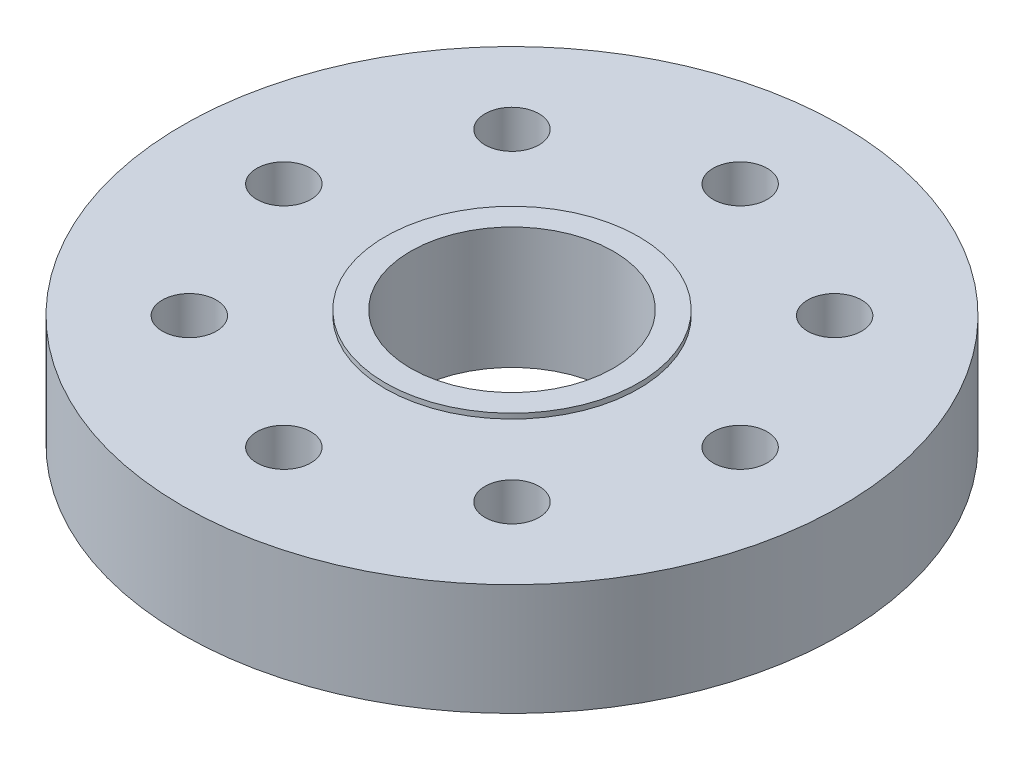
ISO-10303-21;
HEADER;
FILE_DESCRIPTION(('STEP AP214'),'2;1');
FILE_NAME('part.step','',(''),(''),'','','');
FILE_SCHEMA(('AUTOMOTIVE_DESIGN { 1 0 10303 214 1 1 1 1 }'));
ENDSEC;
DATA;
#1=APPLICATION_CONTEXT('core data for automotive mechanical design processes');
#2=APPLICATION_PROTOCOL_DEFINITION('international standard','automotive_design',2000,#1);
#3=PRODUCT_CONTEXT('',#1,'mechanical');
#4=PRODUCT('Part','Part','',(#3));
#5=PRODUCT_RELATED_PRODUCT_CATEGORY('part','',(#4));
#6=PRODUCT_DEFINITION_FORMATION('','',#4);
#7=PRODUCT_DEFINITION_CONTEXT('part definition',#1,'design');
#8=PRODUCT_DEFINITION('design','',#6,#7);
#9=PRODUCT_DEFINITION_SHAPE('','',#8);
#10=(LENGTH_UNIT() NAMED_UNIT(*) SI_UNIT(.MILLI.,.METRE.));
#11=(NAMED_UNIT(*) PLANE_ANGLE_UNIT() SI_UNIT($,.RADIAN.));
#12=(NAMED_UNIT(*) SI_UNIT($,.STERADIAN.) SOLID_ANGLE_UNIT());
#13=UNCERTAINTY_MEASURE_WITH_UNIT(LENGTH_MEASURE(1.E-05),#10,'distance_accuracy_value','');
#14=(GEOMETRIC_REPRESENTATION_CONTEXT(3) GLOBAL_UNCERTAINTY_ASSIGNED_CONTEXT((#13)) GLOBAL_UNIT_ASSIGNED_CONTEXT((#10,
#11,#12)) REPRESENTATION_CONTEXT('',''));
#15=CARTESIAN_POINT('',(0.,0.,0.));
#16=DIRECTION('',(0.,0.,1.));
#17=DIRECTION('',(1.,0.,0.));
#18=AXIS2_PLACEMENT_3D('',#15,#16,#17);
#19=CARTESIAN_POINT('',(0.,-1.65,0.));
#20=DIRECTION('',(0.,1.,0.));
#21=DIRECTION('',(0.,0.,1.));
#22=AXIS2_PLACEMENT_3D('',#19,#20,#21);
#23=PLANE('',#22);
#24=CARTESIAN_POINT('',(-4.7729707730092,-1.65,-4.7729707730092));
#25=DIRECTION('',(0.,1.,0.));
#26=DIRECTION('',(0.,0.,1.));
#27=AXIS2_PLACEMENT_3D('',#24,#25,#26);
#28=CIRCLE('',#27,0.8);
#29=CARTESIAN_POINT('',(-4.7729707730092,-1.65,-3.97297077300919));
#30=VERTEX_POINT('',#29);
#31=EDGE_CURVE('E263',#30,#30,#28,.T.);
#32=ORIENTED_EDGE('',*,*,#31,.T.);
#33=EDGE_LOOP('',(#32));
#34=FACE_BOUND('',#33,.T.);
#35=CARTESIAN_POINT('',(0.,-1.65,0.));
#36=DIRECTION('',(0.,-1.,0.));
#37=DIRECTION('',(0.,0.,-1.));
#38=AXIS2_PLACEMENT_3D('',#35,#36,#37);
#39=CIRCLE('',#38,4.4);
#40=CARTESIAN_POINT('',(-3.57052525047409,-1.65,-2.57125444787694));
#41=VERTEX_POINT('',#40);
#42=CARTESIAN_POINT('',(-3.02772373375921,-1.65,-3.19263041895413));
#43=VERTEX_POINT('',#42);
#44=EDGE_CURVE('E149',#41,#43,#39,.T.);
#45=ORIENTED_EDGE('',*,*,#44,.F.);
#46=CARTESIAN_POINT('',(-4.77297077300901,-1.65,-4.16941738241638));
#47=DIRECTION('',(0.,-1.,0.));
#48=DIRECTION('',(0.,0.,-1.));
#49=AXIS2_PLACEMENT_3D('',#46,#47,#48);
#50=CIRCLE('',#49,2.);
#51=EDGE_CURVE('E135',#41,#43,#50,.T.);
#52=ORIENTED_EDGE('',*,*,#51,.T.);
#53=EDGE_LOOP('',(#45,#52));
#54=FACE_BOUND('',#53,.T.);
#55=ADVANCED_FACE('F38',(#34,#54),#23,.F.);
#56=CARTESIAN_POINT('',(0.,-1.65,-6.75));
#57=DIRECTION('',(0.,1.,0.));
#58=DIRECTION('',(0.,0.,1.));
#59=AXIS2_PLACEMENT_3D('',#56,#57,#58);
#60=CIRCLE('',#59,0.8);
#61=CARTESIAN_POINT('',(0.,-1.65,-5.95));
#62=VERTEX_POINT('',#61);
#63=EDGE_CURVE('E272',#62,#62,#60,.T.);
#64=ORIENTED_EDGE('',*,*,#63,.T.);
#65=EDGE_LOOP('',(#64));
#66=FACE_BOUND('',#65,.T.);
#67=CARTESIAN_POINT('',(-0.571997114225685,-1.65,-4.36266195129963));
#68=VERTEX_POINT('',#67);
#69=CARTESIAN_POINT('',(0.327362601773109,-1.65,-4.38780511497039));
#70=VERTEX_POINT('',#69);
#71=EDGE_CURVE('E142',#68,#70,#39,.T.);
#72=ORIENTED_EDGE('',*,*,#71,.F.);
#73=CARTESIAN_POINT('',(-0.176776695296367,-1.65,-6.32322330470363));
#74=DIRECTION('',(0.,-1.,0.));
#75=DIRECTION('',(0.,0.,-1.));
#76=AXIS2_PLACEMENT_3D('',#73,#74,#75);
#77=CIRCLE('',#76,2.);
#78=EDGE_CURVE('E127',#68,#70,#77,.T.);
#79=ORIENTED_EDGE('',*,*,#78,.T.);
#80=EDGE_LOOP('',(#72,#79));
#81=FACE_BOUND('',#80,.T.);
#82=ADVANCED_FACE('F148',(#66,#81),#23,.F.);
#83=CARTESIAN_POINT('',(-6.75,-1.65,0.));
#84=DIRECTION('',(0.,1.,0.));
#85=DIRECTION('',(0.,0.,1.));
#86=AXIS2_PLACEMENT_3D('',#83,#84,#85);
#87=CIRCLE('',#86,0.800000000000001);
#88=CARTESIAN_POINT('',(-6.75,-1.65,0.800000000000001));
#89=VERTEX_POINT('',#88);
#90=EDGE_CURVE('E275',#89,#89,#87,.T.);
#91=ORIENTED_EDGE('',*,*,#90,.T.);
#92=EDGE_LOOP('',(#91));
#93=FACE_BOUND('',#92,.T.);
#94=CARTESIAN_POINT('',(-6.5,-1.65,0.603553390592734));
#95=DIRECTION('',(0.,-1.,0.));
#96=DIRECTION('',(0.,0.,-1.));
#97=AXIS2_PLACEMENT_3D('',#94,#95,#96);
#98=CIRCLE('',#97,2.);
#99=CARTESIAN_POINT('',(-6.5,-1.65,-1.39644660940727));
#100=VERTEX_POINT('',#99);
#101=EDGE_CURVE('E200',#100,#100,#98,.T.);
#102=ORIENTED_EDGE('',*,*,#101,.T.);
#103=EDGE_LOOP('',(#102));
#104=FACE_BOUND('',#103,.T.);
#105=ADVANCED_FACE('F292',(#93,#104),#23,.F.);
#106=CARTESIAN_POINT('',(0.,-1.65,0.));
#107=DIRECTION('',(0.,1.,0.));
#108=DIRECTION('',(0.,0.,1.));
#109=AXIS2_PLACEMENT_3D('',#106,#107,#108);
#110=CIRCLE('',#109,9.75);
#111=CARTESIAN_POINT('',(0.,-1.65,9.75));
#112=VERTEX_POINT('',#111);
#113=EDGE_CURVE('E42',#112,#112,#110,.T.);
#114=ORIENTED_EDGE('',*,*,#113,.F.);
#115=EDGE_LOOP('',(#114));
#116=FACE_BOUND('',#115,.T.);
#117=CARTESIAN_POINT('',(6.75,-1.65,0.));
#118=DIRECTION('',(0.,1.,0.));
#119=DIRECTION('',(0.,0.,1.));
#120=AXIS2_PLACEMENT_3D('',#117,#118,#119);
#121=CIRCLE('',#120,0.800000000000001);
#122=CARTESIAN_POINT('',(6.75,-1.65,0.800000000000001));
#123=VERTEX_POINT('',#122);
#124=EDGE_CURVE('E280',#123,#123,#121,.T.);
#125=ORIENTED_EDGE('',*,*,#124,.T.);
#126=EDGE_LOOP('',(#125));
#127=FACE_BOUND('',#126,.T.);
#128=CARTESIAN_POINT('',(0.,-1.65,6.75));
#129=DIRECTION('',(0.,1.,0.));
#130=DIRECTION('',(0.,0.,1.));
#131=AXIS2_PLACEMENT_3D('',#128,#129,#130);
#132=CIRCLE('',#131,0.8);
#133=CARTESIAN_POINT('',(0.,-1.65,7.55));
#134=VERTEX_POINT('',#133);
#135=EDGE_CURVE('E278',#134,#134,#132,.T.);
#136=ORIENTED_EDGE('',*,*,#135,.T.);
#137=EDGE_LOOP('',(#136));
#138=FACE_BOUND('',#137,.T.);
#139=CARTESIAN_POINT('',(4.7729707730092,-1.65,4.7729707730092));
#140=DIRECTION('',(0.,1.,0.));
#141=DIRECTION('',(0.,0.,1.));
#142=AXIS2_PLACEMENT_3D('',#139,#140,#141);
#143=CIRCLE('',#142,0.800000000000001);
#144=CARTESIAN_POINT('',(4.7729707730092,-1.65,5.5729707730092));
#145=VERTEX_POINT('',#144);
#146=EDGE_CURVE('E269',#145,#145,#143,.T.);
#147=ORIENTED_EDGE('',*,*,#146,.T.);
#148=EDGE_LOOP('',(#147));
#149=FACE_BOUND('',#148,.T.);
#150=CARTESIAN_POINT('',(-4.7729707730092,-1.65,4.7729707730092));
#151=DIRECTION('',(0.,1.,0.));
#152=DIRECTION('',(0.,0.,1.));
#153=AXIS2_PLACEMENT_3D('',#150,#151,#152);
#154=CIRCLE('',#153,0.8);
#155=CARTESIAN_POINT('',(-4.7729707730092,-1.65,5.5729707730092));
#156=VERTEX_POINT('',#155);
#157=EDGE_CURVE('E266',#156,#156,#154,.T.);
#158=ORIENTED_EDGE('',*,*,#157,.T.);
#159=EDGE_LOOP('',(#158));
#160=FACE_BOUND('',#159,.T.);
#161=CARTESIAN_POINT('',(5.022970773009,-1.65,4.77297077300912));
#162=DIRECTION('',(0.,-1.,0.));
#163=DIRECTION('',(0.,0.,-1.));
#164=AXIS2_PLACEMENT_3D('',#161,#162,#163);
#165=CIRCLE('',#164,2.);
#166=CARTESIAN_POINT('',(5.23241979418587,-1.65,6.76197331386422));
#167=VERTEX_POINT('',#166);
#168=CARTESIAN_POINT('',(7.02006772981787,-1.65,4.88069145396119));
#169=VERTEX_POINT('',#168);
#170=EDGE_CURVE('E55',#167,#169,#165,.T.);
#171=ORIENTED_EDGE('',*,*,#170,.T.);
#172=CARTESIAN_POINT('',(0.,-1.65,0.));
#173=DIRECTION('',(0.,-1.,0.));
#174=DIRECTION('',(0.,0.,-1.));
#175=AXIS2_PLACEMENT_3D('',#172,#173,#174);
#176=CIRCLE('',#175,8.55);
#177=CARTESIAN_POINT('',(8.49370370370371,-1.65,0.979539378325329));
#178=VERTEX_POINT('',#177);
#179=EDGE_CURVE('E189',#178,#169,#176,.T.);
#180=ORIENTED_EDGE('',*,*,#179,.F.);
#181=CARTESIAN_POINT('',(6.75,-1.65,0.));
#182=DIRECTION('',(0.,-1.,0.));
#183=DIRECTION('',(0.,0.,-1.));
#184=AXIS2_PLACEMENT_3D('',#181,#182,#183);
#185=CIRCLE('',#184,2.);
#186=CARTESIAN_POINT('',(8.49370370370371,-1.65,-0.979539378325329));
#187=VERTEX_POINT('',#186);
#188=EDGE_CURVE('E197',#178,#187,#185,.T.);
#189=ORIENTED_EDGE('',*,*,#188,.T.);
#190=CARTESIAN_POINT('',(-6.23877532911509,-1.65,5.8463819916958));
#191=VERTEX_POINT('',#190);
#192=EDGE_CURVE('E196',#191,#187,#176,.T.);
#193=ORIENTED_EDGE('',*,*,#192,.F.);
#194=CARTESIAN_POINT('',(-4.34619407771275,-1.65,5.19974746830537));
#195=DIRECTION('',(0.,-1.,0.));
#196=DIRECTION('',(0.,0.,-1.));
#197=AXIS2_PLACEMENT_3D('',#194,#195,#196);
#198=CIRCLE('',#197,2.);
#199=CARTESIAN_POINT('',(-4.64680378421073,-1.65,7.17702686291788));
#200=VERTEX_POINT('',#199);
#201=EDGE_CURVE('E193',#191,#200,#198,.T.);
#202=ORIENTED_EDGE('',*,*,#201,.T.);
#203=CARTESIAN_POINT('',(-0.790935859810123,-1.65,8.51333779816509));
#204=VERTEX_POINT('',#203);
#205=EDGE_CURVE('E190',#204,#200,#176,.T.);
#206=ORIENTED_EDGE('',*,*,#205,.F.);
#207=CARTESIAN_POINT('',(0.426776695296365,-1.65,6.92677669529637));
#208=DIRECTION('',(0.,-1.,0.));
#209=DIRECTION('',(0.,0.,-1.));
#210=AXIS2_PLACEMENT_3D('',#207,#208,#209);
#211=CIRCLE('',#210,2.);
#212=CARTESIAN_POINT('',(1.83004401429714,-1.65,8.3518524236085));
#213=VERTEX_POINT('',#212);
#214=EDGE_CURVE('E188',#204,#213,#211,.T.);
#215=ORIENTED_EDGE('',*,*,#214,.T.);
#216=EDGE_CURVE('E185',#167,#213,#176,.T.);
#217=ORIENTED_EDGE('',*,*,#216,.F.);
#218=EDGE_LOOP('',(#171,#180,#189,#193,#202,#206,#215,#217));
#219=FACE_BOUND('',#218,.T.);
#220=ADVANCED_FACE('F289',(#116,#127,#138,#149,#160,#219),#23,.F.);
#221=CARTESIAN_POINT('',(4.77297077300919,-1.65,-4.7729707730092));
#222=DIRECTION('',(0.,1.,0.));
#223=DIRECTION('',(0.,0.,1.));
#224=AXIS2_PLACEMENT_3D('',#221,#222,#223);
#225=CIRCLE('',#224,0.800000000000001);
#226=CARTESIAN_POINT('',(4.77297077300919,-1.65,-3.9729707730092));
#227=VERTEX_POINT('',#226);
#228=EDGE_CURVE('E237',#227,#227,#225,.T.);
#229=ORIENTED_EDGE('',*,*,#228,.T.);
#230=EDGE_LOOP('',(#229));
#231=FACE_BOUND('',#230,.T.);
#232=CARTESIAN_POINT('',(4.59619407771275,-1.65,-4.59619407771264));
#233=DIRECTION('',(0.,-1.,0.));
#234=DIRECTION('',(0.,0.,-1.));
#235=AXIS2_PLACEMENT_3D('',#232,#233,#234);
#236=CIRCLE('',#235,2.);
#237=CARTESIAN_POINT('',(4.59619407771275,-1.65,-6.59619407771264));
#238=VERTEX_POINT('',#237);
#239=EDGE_CURVE('E158',#238,#238,#236,.T.);
#240=ORIENTED_EDGE('',*,*,#239,.T.);
#241=EDGE_LOOP('',(#240));
#242=FACE_BOUND('',#241,.T.);
#243=ADVANCED_FACE('F291',(#231,#242),#23,.F.);
#244=CARTESIAN_POINT('',(0.,1.65,0.));
#245=DIRECTION('',(0.,-1.,0.));
#246=DIRECTION('',(0.,0.,-1.));
#247=AXIS2_PLACEMENT_3D('',#244,#245,#246);
#248=CYLINDRICAL_SURFACE('',#247,9.75);
#249=CARTESIAN_POINT('',(0.,1.65,0.));
#250=DIRECTION('',(0.,1.,0.));
#251=DIRECTION('',(0.,0.,1.));
#252=AXIS2_PLACEMENT_3D('',#249,#250,#251);
#253=CIRCLE('',#252,9.75);
#254=CARTESIAN_POINT('',(0.,1.65,9.75));
#255=VERTEX_POINT('',#254);
#256=EDGE_CURVE('E11',#255,#255,#253,.T.);
#257=ORIENTED_EDGE('',*,*,#256,.F.);
#258=EDGE_LOOP('',(#257));
#259=FACE_BOUND('',#258,.T.);
#260=ORIENTED_EDGE('',*,*,#113,.T.);
#261=EDGE_LOOP('',(#260));
#262=FACE_BOUND('',#261,.T.);
#263=ADVANCED_FACE('F287',(#259,#262),#248,.T.);
#264=CARTESIAN_POINT('',(6.75,1.65,0.));
#265=DIRECTION('',(0.,-1.,0.));
#266=DIRECTION('',(0.,0.,-1.));
#267=AXIS2_PLACEMENT_3D('',#264,#265,#266);
#268=CYLINDRICAL_SURFACE('',#267,0.800000000000001);
#269=CARTESIAN_POINT('',(6.75,1.65,0.));
#270=DIRECTION('',(0.,1.,0.));
#271=DIRECTION('',(0.,0.,1.));
#272=AXIS2_PLACEMENT_3D('',#269,#270,#271);
#273=CIRCLE('',#272,0.800000000000001);
#274=CARTESIAN_POINT('',(6.75,1.65,0.800000000000001));
#275=VERTEX_POINT('',#274);
#276=EDGE_CURVE('E47',#275,#275,#273,.T.);
#277=ORIENTED_EDGE('',*,*,#276,.T.);
#278=EDGE_LOOP('',(#277));
#279=FACE_BOUND('',#278,.T.);
#280=ORIENTED_EDGE('',*,*,#124,.F.);
#281=EDGE_LOOP('',(#280));
#282=FACE_BOUND('',#281,.T.);
#283=ADVANCED_FACE('F374',(#279,#282),#268,.F.);
#284=CARTESIAN_POINT('',(0.,1.65,6.75));
#285=DIRECTION('',(0.,-1.,0.));
#286=DIRECTION('',(0.,0.,-1.));
#287=AXIS2_PLACEMENT_3D('',#284,#285,#286);
#288=CYLINDRICAL_SURFACE('',#287,0.8);
#289=CARTESIAN_POINT('',(0.,1.65,6.75));
#290=DIRECTION('',(0.,1.,0.));
#291=DIRECTION('',(0.,0.,1.));
#292=AXIS2_PLACEMENT_3D('',#289,#290,#291);
#293=CIRCLE('',#292,0.8);
#294=CARTESIAN_POINT('',(0.,1.65,7.55));
#295=VERTEX_POINT('',#294);
#296=EDGE_CURVE('E256',#295,#295,#293,.T.);
#297=ORIENTED_EDGE('',*,*,#296,.T.);
#298=EDGE_LOOP('',(#297));
#299=FACE_BOUND('',#298,.T.);
#300=ORIENTED_EDGE('',*,*,#135,.F.);
#301=EDGE_LOOP('',(#300));
#302=FACE_BOUND('',#301,.T.);
#303=ADVANCED_FACE('F454',(#299,#302),#288,.F.);
#304=CARTESIAN_POINT('',(-6.75,1.65,0.));
#305=DIRECTION('',(0.,-1.,0.));
#306=DIRECTION('',(0.,0.,-1.));
#307=AXIS2_PLACEMENT_3D('',#304,#305,#306);
#308=CYLINDRICAL_SURFACE('',#307,0.800000000000001);
#309=CARTESIAN_POINT('',(-6.75,1.65,0.));
#310=DIRECTION('',(0.,1.,0.));
#311=DIRECTION('',(0.,0.,1.));
#312=AXIS2_PLACEMENT_3D('',#309,#310,#311);
#313=CIRCLE('',#312,0.800000000000001);
#314=CARTESIAN_POINT('',(-6.75,1.65,0.800000000000001));
#315=VERTEX_POINT('',#314);
#316=EDGE_CURVE('E253',#315,#315,#313,.T.);
#317=ORIENTED_EDGE('',*,*,#316,.T.);
#318=EDGE_LOOP('',(#317));
#319=FACE_BOUND('',#318,.T.);
#320=ORIENTED_EDGE('',*,*,#90,.F.);
#321=EDGE_LOOP('',(#320));
#322=FACE_BOUND('',#321,.T.);
#323=ADVANCED_FACE('F459',(#319,#322),#308,.F.);
#324=CARTESIAN_POINT('',(0.,1.65,-6.75));
#325=DIRECTION('',(0.,-1.,0.));
#326=DIRECTION('',(0.,0.,-1.));
#327=AXIS2_PLACEMENT_3D('',#324,#325,#326);
#328=CYLINDRICAL_SURFACE('',#327,0.8);
#329=CARTESIAN_POINT('',(0.,1.65,-6.75));
#330=DIRECTION('',(0.,1.,0.));
#331=DIRECTION('',(0.,0.,1.));
#332=AXIS2_PLACEMENT_3D('',#329,#330,#331);
#333=CIRCLE('',#332,0.8);
#334=CARTESIAN_POINT('',(0.,1.65,-5.95));
#335=VERTEX_POINT('',#334);
#336=EDGE_CURVE('E250',#335,#335,#333,.T.);
#337=ORIENTED_EDGE('',*,*,#336,.T.);
#338=EDGE_LOOP('',(#337));
#339=FACE_BOUND('',#338,.T.);
#340=ORIENTED_EDGE('',*,*,#63,.F.);
#341=EDGE_LOOP('',(#340));
#342=FACE_BOUND('',#341,.T.);
#343=ADVANCED_FACE('F465',(#339,#342),#328,.F.);
#344=CARTESIAN_POINT('',(4.7729707730092,1.65,4.7729707730092));
#345=DIRECTION('',(0.,-1.,0.));
#346=DIRECTION('',(0.,0.,-1.));
#347=AXIS2_PLACEMENT_3D('',#344,#345,#346);
#348=CYLINDRICAL_SURFACE('',#347,0.800000000000001);
#349=CARTESIAN_POINT('',(4.7729707730092,1.65,4.7729707730092));
#350=DIRECTION('',(0.,1.,0.));
#351=DIRECTION('',(0.,0.,1.));
#352=AXIS2_PLACEMENT_3D('',#349,#350,#351);
#353=CIRCLE('',#352,0.800000000000001);
#354=CARTESIAN_POINT('',(4.7729707730092,1.65,5.5729707730092));
#355=VERTEX_POINT('',#354);
#356=EDGE_CURVE('E247',#355,#355,#353,.T.);
#357=ORIENTED_EDGE('',*,*,#356,.T.);
#358=EDGE_LOOP('',(#357));
#359=FACE_BOUND('',#358,.T.);
#360=ORIENTED_EDGE('',*,*,#146,.F.);
#361=EDGE_LOOP('',(#360));
#362=FACE_BOUND('',#361,.T.);
#363=ADVANCED_FACE('F469',(#359,#362),#348,.F.);
#364=CARTESIAN_POINT('',(-4.7729707730092,1.65,4.7729707730092));
#365=DIRECTION('',(0.,-1.,0.));
#366=DIRECTION('',(0.,0.,-1.));
#367=AXIS2_PLACEMENT_3D('',#364,#365,#366);
#368=CYLINDRICAL_SURFACE('',#367,0.8);
#369=CARTESIAN_POINT('',(-4.7729707730092,1.65,4.7729707730092));
#370=DIRECTION('',(0.,1.,0.));
#371=DIRECTION('',(0.,0.,1.));
#372=AXIS2_PLACEMENT_3D('',#369,#370,#371);
#373=CIRCLE('',#372,0.8);
#374=CARTESIAN_POINT('',(-4.7729707730092,1.65,5.5729707730092));
#375=VERTEX_POINT('',#374);
#376=EDGE_CURVE('E244',#375,#375,#373,.T.);
#377=ORIENTED_EDGE('',*,*,#376,.T.);
#378=EDGE_LOOP('',(#377));
#379=FACE_BOUND('',#378,.T.);
#380=ORIENTED_EDGE('',*,*,#157,.F.);
#381=EDGE_LOOP('',(#380));
#382=FACE_BOUND('',#381,.T.);
#383=ADVANCED_FACE('F473',(#379,#382),#368,.F.);
#384=CARTESIAN_POINT('',(-4.7729707730092,1.65,-4.7729707730092));
#385=DIRECTION('',(0.,-1.,0.));
#386=DIRECTION('',(0.,0.,-1.));
#387=AXIS2_PLACEMENT_3D('',#384,#385,#386);
#388=CYLINDRICAL_SURFACE('',#387,0.8);
#389=CARTESIAN_POINT('',(-4.7729707730092,1.65,-4.7729707730092));
#390=DIRECTION('',(0.,1.,0.));
#391=DIRECTION('',(0.,0.,1.));
#392=AXIS2_PLACEMENT_3D('',#389,#390,#391);
#393=CIRCLE('',#392,0.8);
#394=CARTESIAN_POINT('',(-4.7729707730092,1.65,-3.97297077300919));
#395=VERTEX_POINT('',#394);
#396=EDGE_CURVE('E241',#395,#395,#393,.T.);
#397=ORIENTED_EDGE('',*,*,#396,.T.);
#398=EDGE_LOOP('',(#397));
#399=FACE_BOUND('',#398,.T.);
#400=ORIENTED_EDGE('',*,*,#31,.F.);
#401=EDGE_LOOP('',(#400));
#402=FACE_BOUND('',#401,.T.);
#403=ADVANCED_FACE('F430',(#399,#402),#388,.F.);
#404=CARTESIAN_POINT('',(4.77297077300919,1.65,-4.7729707730092));
#405=DIRECTION('',(0.,-1.,0.));
#406=DIRECTION('',(0.,0.,-1.));
#407=AXIS2_PLACEMENT_3D('',#404,#405,#406);
#408=CYLINDRICAL_SURFACE('',#407,0.800000000000001);
#409=CARTESIAN_POINT('',(4.77297077300919,1.65,-4.7729707730092));
#410=DIRECTION('',(0.,1.,0.));
#411=DIRECTION('',(0.,0.,1.));
#412=AXIS2_PLACEMENT_3D('',#409,#410,#411);
#413=CIRCLE('',#412,0.800000000000001);
#414=CARTESIAN_POINT('',(4.77297077300919,1.65,-3.9729707730092));
#415=VERTEX_POINT('',#414);
#416=EDGE_CURVE('E238',#415,#415,#413,.T.);
#417=ORIENTED_EDGE('',*,*,#416,.T.);
#418=EDGE_LOOP('',(#417));
#419=FACE_BOUND('',#418,.T.);
#420=ORIENTED_EDGE('',*,*,#228,.F.);
#421=EDGE_LOOP('',(#420));
#422=FACE_BOUND('',#421,.T.);
#423=ADVANCED_FACE('F40',(#419,#422),#408,.F.);
#424=CARTESIAN_POINT('',(0.,1.65,0.));
#425=DIRECTION('',(0.,1.,0.));
#426=DIRECTION('',(0.,0.,1.));
#427=AXIS2_PLACEMENT_3D('',#424,#425,#426);
#428=PLANE('',#427);
#429=CARTESIAN_POINT('',(0.,1.65,0.));
#430=DIRECTION('',(0.,1.,0.));
#431=DIRECTION('',(0.,0.,1.));
#432=AXIS2_PLACEMENT_3D('',#429,#430,#431);
#433=CIRCLE('',#432,3.75);
#434=CARTESIAN_POINT('',(0.,1.65,3.75));
#435=VERTEX_POINT('',#434);
#436=EDGE_CURVE('E232',#435,#435,#433,.F.);
#437=ORIENTED_EDGE('',*,*,#436,.T.);
#438=EDGE_LOOP('',(#437));
#439=FACE_BOUND('',#438,.T.);
#440=ORIENTED_EDGE('',*,*,#416,.F.);
#441=EDGE_LOOP('',(#440));
#442=FACE_BOUND('',#441,.T.);
#443=ORIENTED_EDGE('',*,*,#396,.F.);
#444=EDGE_LOOP('',(#443));
#445=FACE_BOUND('',#444,.T.);
#446=ORIENTED_EDGE('',*,*,#376,.F.);
#447=EDGE_LOOP('',(#446));
#448=FACE_BOUND('',#447,.T.);
#449=ORIENTED_EDGE('',*,*,#356,.F.);
#450=EDGE_LOOP('',(#449));
#451=FACE_BOUND('',#450,.T.);
#452=ORIENTED_EDGE('',*,*,#336,.F.);
#453=EDGE_LOOP('',(#452));
#454=FACE_BOUND('',#453,.T.);
#455=ORIENTED_EDGE('',*,*,#316,.F.);
#456=EDGE_LOOP('',(#455));
#457=FACE_BOUND('',#456,.T.);
#458=ORIENTED_EDGE('',*,*,#296,.F.);
#459=EDGE_LOOP('',(#458));
#460=FACE_BOUND('',#459,.T.);
#461=ORIENTED_EDGE('',*,*,#276,.F.);
#462=EDGE_LOOP('',(#461));
#463=FACE_BOUND('',#462,.T.);
#464=ORIENTED_EDGE('',*,*,#256,.T.);
#465=EDGE_LOOP('',(#464));
#466=FACE_BOUND('',#465,.T.);
#467=ADVANCED_FACE('F421',(#439,#442,#445,#448,#451,#454,#457,#460,#463,#466),#428,.T.);
#468=CARTESIAN_POINT('',(0.,-1.8,0.));
#469=DIRECTION('',(0.,1.,0.));
#470=DIRECTION('',(0.,0.,1.));
#471=AXIS2_PLACEMENT_3D('',#468,#469,#470);
#472=PLANE('',#471);
#473=CARTESIAN_POINT('',(0.,-1.8,0.));
#474=DIRECTION('',(0.,1.,0.));
#475=DIRECTION('',(0.,0.,1.));
#476=AXIS2_PLACEMENT_3D('',#473,#474,#475);
#477=CIRCLE('',#476,3.);
#478=CARTESIAN_POINT('',(0.,-1.8,3.));
#479=VERTEX_POINT('',#478);
#480=EDGE_CURVE('E207',#479,#479,#477,.T.);
#481=ORIENTED_EDGE('',*,*,#480,.T.);
#482=EDGE_LOOP('',(#481));
#483=FACE_BOUND('',#482,.T.);
#484=CARTESIAN_POINT('',(0.,-1.8,0.));
#485=DIRECTION('',(0.,-1.,0.));
#486=DIRECTION('',(0.,0.,-1.));
#487=AXIS2_PLACEMENT_3D('',#484,#485,#486);
#488=CIRCLE('',#487,4.4);
#489=CARTESIAN_POINT('',(0.,-1.8,-4.4));
#490=VERTEX_POINT('',#489);
#491=EDGE_CURVE('E136',#490,#490,#488,.T.);
#492=ORIENTED_EDGE('',*,*,#491,.T.);
#493=EDGE_LOOP('',(#492));
#494=FACE_BOUND('',#493,.T.);
#495=ADVANCED_FACE('F417',(#483,#494),#472,.F.);
#496=CARTESIAN_POINT('',(0.,1.65,0.));
#497=DIRECTION('',(0.,-1.,0.));
#498=DIRECTION('',(0.,0.,-1.));
#499=AXIS2_PLACEMENT_3D('',#496,#497,#498);
#500=CYLINDRICAL_SURFACE('',#499,3.);
#501=ORIENTED_EDGE('',*,*,#480,.F.);
#502=EDGE_LOOP('',(#501));
#503=FACE_BOUND('',#502,.T.);
#504=CARTESIAN_POINT('',(0.,1.8,0.));
#505=DIRECTION('',(0.,1.,0.));
#506=DIRECTION('',(0.,0.,1.));
#507=AXIS2_PLACEMENT_3D('',#504,#505,#506);
#508=CIRCLE('',#507,3.);
#509=CARTESIAN_POINT('',(0.,1.8,3.));
#510=VERTEX_POINT('',#509);
#511=EDGE_CURVE('E226',#510,#510,#508,.T.);
#512=ORIENTED_EDGE('',*,*,#511,.T.);
#513=EDGE_LOOP('',(#512));
#514=FACE_BOUND('',#513,.T.);
#515=ADVANCED_FACE('F420',(#503,#514),#500,.F.);
#516=CARTESIAN_POINT('',(0.,1.8,0.));
#517=DIRECTION('',(0.,-1.,0.));
#518=DIRECTION('',(0.,0.,-1.));
#519=AXIS2_PLACEMENT_3D('',#516,#517,#518);
#520=CYLINDRICAL_SURFACE('',#519,3.75);
#521=ORIENTED_EDGE('',*,*,#436,.F.);
#522=EDGE_LOOP('',(#521));
#523=FACE_BOUND('',#522,.T.);
#524=CARTESIAN_POINT('',(0.,1.8,0.));
#525=DIRECTION('',(0.,1.,0.));
#526=DIRECTION('',(0.,0.,1.));
#527=AXIS2_PLACEMENT_3D('',#524,#525,#526);
#528=CIRCLE('',#527,3.75);
#529=CARTESIAN_POINT('',(0.,1.8,3.75));
#530=VERTEX_POINT('',#529);
#531=EDGE_CURVE('E229',#530,#530,#528,.T.);
#532=ORIENTED_EDGE('',*,*,#531,.F.);
#533=EDGE_LOOP('',(#532));
#534=FACE_BOUND('',#533,.T.);
#535=ADVANCED_FACE('F415',(#523,#534),#520,.T.);
#536=CARTESIAN_POINT('',(0.,1.8,0.));
#537=DIRECTION('',(0.,1.,0.));
#538=DIRECTION('',(0.,0.,1.));
#539=AXIS2_PLACEMENT_3D('',#536,#537,#538);
#540=PLANE('',#539);
#541=ORIENTED_EDGE('',*,*,#511,.F.);
#542=EDGE_LOOP('',(#541));
#543=FACE_BOUND('',#542,.T.);
#544=ORIENTED_EDGE('',*,*,#531,.T.);
#545=EDGE_LOOP('',(#544));
#546=FACE_BOUND('',#545,.T.);
#547=ADVANCED_FACE('F349',(#543,#546),#540,.T.);
#548=CARTESIAN_POINT('',(5.022970773009,0.15,4.77297077300912));
#549=DIRECTION('',(0.,-1.,0.));
#550=DIRECTION('',(0.,0.,-1.));
#551=AXIS2_PLACEMENT_3D('',#548,#549,#550);
#552=CYLINDRICAL_SURFACE('',#551,2.);
#553=ORIENTED_EDGE('',*,*,#170,.F.);
#554=DIRECTION('',(0.,-1.,0.));
#555=VECTOR('',#554,1.);
#556=CARTESIAN_POINT('',(5.23241979418587,0.15,6.76197331386422));
#557=LINE('',#556,#555);
#558=CARTESIAN_POINT('',(5.23241979418587,0.15,6.76197331386422));
#559=VERTEX_POINT('',#558);
#560=EDGE_CURVE('E220',#559,#167,#557,.T.);
#561=ORIENTED_EDGE('',*,*,#560,.F.);
#562=CARTESIAN_POINT('',(5.022970773009,0.15,4.77297077300912));
#563=DIRECTION('',(0.,-1.,0.));
#564=DIRECTION('',(0.,0.,-1.));
#565=AXIS2_PLACEMENT_3D('',#562,#563,#564);
#566=CIRCLE('',#565,2.);
#567=CARTESIAN_POINT('',(7.02006772981787,0.15,4.88069145396119));
#568=VERTEX_POINT('',#567);
#569=EDGE_CURVE('E162',#559,#568,#566,.T.);
#570=ORIENTED_EDGE('',*,*,#569,.T.);
#571=DIRECTION('',(0.,-1.,0.));
#572=VECTOR('',#571,1.);
#573=CARTESIAN_POINT('',(7.02006772981787,0.15,4.88069145396119));
#574=LINE('',#573,#572);
#575=EDGE_CURVE('E205',#568,#169,#574,.T.);
#576=ORIENTED_EDGE('',*,*,#575,.T.);
#577=EDGE_LOOP('',(#553,#561,#570,#576));
#578=FACE_BOUND('',#577,.T.);
#579=ADVANCED_FACE('F311',(#578),#552,.T.);
#580=CARTESIAN_POINT('',(0.,0.15,0.));
#581=DIRECTION('',(0.,-1.,0.));
#582=DIRECTION('',(0.,0.,-1.));
#583=AXIS2_PLACEMENT_3D('',#580,#581,#582);
#584=CYLINDRICAL_SURFACE('',#583,8.55);
#585=ORIENTED_EDGE('',*,*,#179,.T.);
#586=ORIENTED_EDGE('',*,*,#575,.F.);
#587=CARTESIAN_POINT('',(0.,0.15,0.));
#588=DIRECTION('',(0.,-1.,0.));
#589=DIRECTION('',(0.,0.,-1.));
#590=AXIS2_PLACEMENT_3D('',#587,#588,#589);
#591=CIRCLE('',#590,8.55);
#592=CARTESIAN_POINT('',(8.49370370370371,0.15,0.979539378325329));
#593=VERTEX_POINT('',#592);
#594=EDGE_CURVE('E168',#593,#568,#591,.T.);
#595=ORIENTED_EDGE('',*,*,#594,.F.);
#596=DIRECTION('',(0.,-1.,0.));
#597=VECTOR('',#596,1.);
#598=CARTESIAN_POINT('',(8.49370370370371,0.15,0.979539378325329));
#599=LINE('',#598,#597);
#600=EDGE_CURVE('E208',#593,#178,#599,.T.);
#601=ORIENTED_EDGE('',*,*,#600,.T.);
#602=EDGE_LOOP('',(#585,#586,#595,#601));
#603=FACE_BOUND('',#602,.T.);
#604=ADVANCED_FACE('F341',(#603),#584,.F.);
#605=CARTESIAN_POINT('',(6.75,0.15,0.));
#606=DIRECTION('',(0.,-1.,0.));
#607=DIRECTION('',(0.,0.,-1.));
#608=AXIS2_PLACEMENT_3D('',#605,#606,#607);
#609=CYLINDRICAL_SURFACE('',#608,2.);
#610=ORIENTED_EDGE('',*,*,#188,.F.);
#611=ORIENTED_EDGE('',*,*,#600,.F.);
#612=CARTESIAN_POINT('',(6.75,0.15,0.));
#613=DIRECTION('',(0.,-1.,0.));
#614=DIRECTION('',(0.,0.,-1.));
#615=AXIS2_PLACEMENT_3D('',#612,#613,#614);
#616=CIRCLE('',#615,2.);
#617=CARTESIAN_POINT('',(8.49370370370371,0.15,-0.979539378325329));
#618=VERTEX_POINT('',#617);
#619=EDGE_CURVE('E174',#593,#618,#616,.T.);
#620=ORIENTED_EDGE('',*,*,#619,.T.);
#621=DIRECTION('',(0.,-1.,0.));
#622=VECTOR('',#621,1.);
#623=CARTESIAN_POINT('',(8.49370370370371,0.15,-0.979539378325329));
#624=LINE('',#623,#622);
#625=EDGE_CURVE('E210',#618,#187,#624,.T.);
#626=ORIENTED_EDGE('',*,*,#625,.T.);
#627=EDGE_LOOP('',(#610,#611,#620,#626));
#628=FACE_BOUND('',#627,.T.);
#629=ADVANCED_FACE('F340',(#628),#609,.T.);
#630=ORIENTED_EDGE('',*,*,#192,.T.);
#631=ORIENTED_EDGE('',*,*,#625,.F.);
#632=CARTESIAN_POINT('',(-6.23877532911509,0.15,5.8463819916958));
#633=VERTEX_POINT('',#632);
#634=EDGE_CURVE('E173',#633,#618,#591,.T.);
#635=ORIENTED_EDGE('',*,*,#634,.F.);
#636=DIRECTION('',(0.,-1.,0.));
#637=VECTOR('',#636,1.);
#638=CARTESIAN_POINT('',(-6.23877532911509,0.15,5.8463819916958));
#639=LINE('',#638,#637);
#640=EDGE_CURVE('E212',#633,#191,#639,.T.);
#641=ORIENTED_EDGE('',*,*,#640,.T.);
#642=EDGE_LOOP('',(#630,#631,#635,#641));
#643=FACE_BOUND('',#642,.T.);
#644=ADVANCED_FACE('F336',(#643),#584,.F.);
#645=CARTESIAN_POINT('',(-4.34619407771275,0.15,5.19974746830537));
#646=DIRECTION('',(0.,-1.,0.));
#647=DIRECTION('',(0.,0.,-1.));
#648=AXIS2_PLACEMENT_3D('',#645,#646,#647);
#649=CYLINDRICAL_SURFACE('',#648,2.);
#650=ORIENTED_EDGE('',*,*,#201,.F.);
#651=ORIENTED_EDGE('',*,*,#640,.F.);
#652=CARTESIAN_POINT('',(-4.34619407771275,0.15,5.19974746830537));
#653=DIRECTION('',(0.,-1.,0.));
#654=DIRECTION('',(0.,0.,-1.));
#655=AXIS2_PLACEMENT_3D('',#652,#653,#654);
#656=CIRCLE('',#655,2.);
#657=CARTESIAN_POINT('',(-4.64680378421073,0.15,7.17702686291788));
#658=VERTEX_POINT('',#657);
#659=EDGE_CURVE('E171',#633,#658,#656,.T.);
#660=ORIENTED_EDGE('',*,*,#659,.T.);
#661=DIRECTION('',(0.,-1.,0.));
#662=VECTOR('',#661,1.);
#663=CARTESIAN_POINT('',(-4.64680378421073,0.15,7.17702686291788));
#664=LINE('',#663,#662);
#665=EDGE_CURVE('E214',#658,#200,#664,.T.);
#666=ORIENTED_EDGE('',*,*,#665,.T.);
#667=EDGE_LOOP('',(#650,#651,#660,#666));
#668=FACE_BOUND('',#667,.T.);
#669=ADVANCED_FACE('F332',(#668),#649,.T.);
#670=ORIENTED_EDGE('',*,*,#205,.T.);
#671=ORIENTED_EDGE('',*,*,#665,.F.);
#672=CARTESIAN_POINT('',(-0.790935859810123,0.15,8.51333779816509));
#673=VERTEX_POINT('',#672);
#674=EDGE_CURVE('E169',#673,#658,#591,.T.);
#675=ORIENTED_EDGE('',*,*,#674,.F.);
#676=DIRECTION('',(0.,-1.,0.));
#677=VECTOR('',#676,1.);
#678=CARTESIAN_POINT('',(-0.790935859810123,0.15,8.51333779816509));
#679=LINE('',#678,#677);
#680=EDGE_CURVE('E216',#673,#204,#679,.T.);
#681=ORIENTED_EDGE('',*,*,#680,.T.);
#682=EDGE_LOOP('',(#670,#671,#675,#681));
#683=FACE_BOUND('',#682,.T.);
#684=ADVANCED_FACE('F329',(#683),#584,.F.);
#685=CARTESIAN_POINT('',(0.426776695296365,0.15,6.92677669529637));
#686=DIRECTION('',(0.,-1.,0.));
#687=DIRECTION('',(0.,0.,-1.));
#688=AXIS2_PLACEMENT_3D('',#685,#686,#687);
#689=CYLINDRICAL_SURFACE('',#688,2.);
#690=ORIENTED_EDGE('',*,*,#214,.F.);
#691=ORIENTED_EDGE('',*,*,#680,.F.);
#692=CARTESIAN_POINT('',(0.426776695296365,0.15,6.92677669529637));
#693=DIRECTION('',(0.,-1.,0.));
#694=DIRECTION('',(0.,0.,-1.));
#695=AXIS2_PLACEMENT_3D('',#692,#693,#694);
#696=CIRCLE('',#695,2.);
#697=CARTESIAN_POINT('',(1.83004401429714,0.15,8.3518524236085));
#698=VERTEX_POINT('',#697);
#699=EDGE_CURVE('E167',#673,#698,#696,.T.);
#700=ORIENTED_EDGE('',*,*,#699,.T.);
#701=DIRECTION('',(0.,-1.,0.));
#702=VECTOR('',#701,1.);
#703=CARTESIAN_POINT('',(1.83004401429714,0.15,8.3518524236085));
#704=LINE('',#703,#702);
#705=EDGE_CURVE('E218',#698,#213,#704,.T.);
#706=ORIENTED_EDGE('',*,*,#705,.T.);
#707=EDGE_LOOP('',(#690,#691,#700,#706));
#708=FACE_BOUND('',#707,.T.);
#709=ADVANCED_FACE('F408',(#708),#689,.T.);
#710=CARTESIAN_POINT('',(0.,0.15,0.));
#711=DIRECTION('',(0.,-1.,0.));
#712=DIRECTION('',(0.,0.,-1.));
#713=AXIS2_PLACEMENT_3D('',#710,#711,#712);
#714=CYLINDRICAL_SURFACE('',#713,4.4);
#715=DIRECTION('',(0.,-1.,0.));
#716=VECTOR('',#715,1.);
#717=CARTESIAN_POINT('',(-3.57052525047409,0.15,-2.57125444787694));
#718=LINE('',#717,#716);
#719=CARTESIAN_POINT('',(-3.57052525047409,0.15,-2.57125444787694));
#720=VERTEX_POINT('',#719);
#721=EDGE_CURVE('E222',#720,#41,#718,.T.);
#722=ORIENTED_EDGE('',*,*,#721,.T.);
#723=ORIENTED_EDGE('',*,*,#44,.T.);
#724=DIRECTION('',(0.,-1.,0.));
#725=VECTOR('',#724,1.);
#726=CARTESIAN_POINT('',(-3.02772373375921,0.15,-3.19263041895413));
#727=LINE('',#726,#725);
#728=CARTESIAN_POINT('',(-3.02772373375921,0.15,-3.19263041895413));
#729=VERTEX_POINT('',#728);
#730=EDGE_CURVE('E146',#729,#43,#727,.T.);
#731=ORIENTED_EDGE('',*,*,#730,.F.);
#732=CARTESIAN_POINT('',(0.,0.15,0.));
#733=DIRECTION('',(0.,-1.,0.));
#734=DIRECTION('',(0.,0.,-1.));
#735=AXIS2_PLACEMENT_3D('',#732,#733,#734);
#736=CIRCLE('',#735,4.4);
#737=CARTESIAN_POINT('',(-0.571997114225681,0.15,-4.36266195129963));
#738=VERTEX_POINT('',#737);
#739=EDGE_CURVE('E145',#729,#738,#736,.T.);
#740=ORIENTED_EDGE('',*,*,#739,.T.);
#741=DIRECTION('',(0.,-1.,0.));
#742=VECTOR('',#741,1.);
#743=CARTESIAN_POINT('',(-0.571997114225681,0.15,-4.36266195129963));
#744=LINE('',#743,#742);
#745=EDGE_CURVE('E130',#738,#68,#744,.T.);
#746=ORIENTED_EDGE('',*,*,#745,.T.);
#747=ORIENTED_EDGE('',*,*,#71,.T.);
#748=DIRECTION('',(0.,-1.,0.));
#749=VECTOR('',#748,1.);
#750=CARTESIAN_POINT('',(0.327362601773109,0.15,-4.38780511497039));
#751=LINE('',#750,#749);
#752=CARTESIAN_POINT('',(0.327362601773109,0.15,-4.38780511497039));
#753=VERTEX_POINT('',#752);
#754=EDGE_CURVE('E63',#753,#70,#751,.T.);
#755=ORIENTED_EDGE('',*,*,#754,.F.);
#756=EDGE_CURVE('E154',#753,#720,#736,.T.);
#757=ORIENTED_EDGE('',*,*,#756,.T.);
#758=EDGE_LOOP('',(#722,#723,#731,#740,#746,#747,#755,#757));
#759=FACE_BOUND('',#758,.T.);
#760=ORIENTED_EDGE('',*,*,#491,.F.);
#761=EDGE_LOOP('',(#760));
#762=FACE_BOUND('',#761,.T.);
#763=ADVANCED_FACE('F140',(#759,#762),#714,.T.);
#764=CARTESIAN_POINT('',(-4.77297077300901,0.15,-4.16941738241638));
#765=DIRECTION('',(0.,-1.,0.));
#766=DIRECTION('',(0.,0.,-1.));
#767=AXIS2_PLACEMENT_3D('',#764,#765,#766);
#768=CYLINDRICAL_SURFACE('',#767,2.);
#769=ORIENTED_EDGE('',*,*,#51,.F.);
#770=ORIENTED_EDGE('',*,*,#721,.F.);
#771=CARTESIAN_POINT('',(-4.77297077300901,0.15,-4.16941738241638));
#772=DIRECTION('',(0.,-1.,0.));
#773=DIRECTION('',(0.,0.,-1.));
#774=AXIS2_PLACEMENT_3D('',#771,#772,#773);
#775=CIRCLE('',#774,2.);
#776=EDGE_CURVE('E160',#720,#729,#775,.T.);
#777=ORIENTED_EDGE('',*,*,#776,.T.);
#778=ORIENTED_EDGE('',*,*,#730,.T.);
#779=EDGE_LOOP('',(#769,#770,#777,#778));
#780=FACE_BOUND('',#779,.T.);
#781=ADVANCED_FACE('F393',(#780),#768,.T.);
#782=CARTESIAN_POINT('',(-6.5,0.15,0.603553390592734));
#783=DIRECTION('',(0.,-1.,0.));
#784=DIRECTION('',(0.,0.,-1.));
#785=AXIS2_PLACEMENT_3D('',#782,#783,#784);
#786=CYLINDRICAL_SURFACE('',#785,2.);
#787=CARTESIAN_POINT('',(-6.5,0.15,0.603553390592734));
#788=DIRECTION('',(0.,-1.,0.));
#789=DIRECTION('',(0.,0.,-1.));
#790=AXIS2_PLACEMENT_3D('',#787,#788,#789);
#791=CIRCLE('',#790,2.);
#792=CARTESIAN_POINT('',(-6.5,0.15,-1.39644660940727));
#793=VERTEX_POINT('',#792);
#794=EDGE_CURVE('E176',#793,#793,#791,.T.);
#795=ORIENTED_EDGE('',*,*,#794,.T.);
#796=EDGE_LOOP('',(#795));
#797=FACE_BOUND('',#796,.T.);
#798=ORIENTED_EDGE('',*,*,#101,.F.);
#799=EDGE_LOOP('',(#798));
#800=FACE_BOUND('',#799,.T.);
#801=ADVANCED_FACE('F353',(#797,#800),#786,.T.);
#802=ORIENTED_EDGE('',*,*,#216,.T.);
#803=ORIENTED_EDGE('',*,*,#705,.F.);
#804=EDGE_CURVE('E164',#559,#698,#591,.T.);
#805=ORIENTED_EDGE('',*,*,#804,.F.);
#806=ORIENTED_EDGE('',*,*,#560,.T.);
#807=EDGE_LOOP('',(#802,#803,#805,#806));
#808=FACE_BOUND('',#807,.T.);
#809=ADVANCED_FACE('F308',(#808),#584,.F.);
#810=CARTESIAN_POINT('',(-0.176776695296367,0.15,-6.32322330470363));
#811=DIRECTION('',(0.,-1.,0.));
#812=DIRECTION('',(0.,0.,-1.));
#813=AXIS2_PLACEMENT_3D('',#810,#811,#812);
#814=CYLINDRICAL_SURFACE('',#813,2.);
#815=ORIENTED_EDGE('',*,*,#78,.F.);
#816=ORIENTED_EDGE('',*,*,#745,.F.);
#817=CARTESIAN_POINT('',(-0.176776695296367,0.15,-6.32322330470363));
#818=DIRECTION('',(0.,-1.,0.));
#819=DIRECTION('',(0.,0.,-1.));
#820=AXIS2_PLACEMENT_3D('',#817,#818,#819);
#821=CIRCLE('',#820,2.);
#822=EDGE_CURVE('E157',#738,#753,#821,.T.);
#823=ORIENTED_EDGE('',*,*,#822,.T.);
#824=ORIENTED_EDGE('',*,*,#754,.T.);
#825=EDGE_LOOP('',(#815,#816,#823,#824));
#826=FACE_BOUND('',#825,.T.);
#827=ADVANCED_FACE('F129',(#826),#814,.T.);
#828=CARTESIAN_POINT('',(4.59619407771275,0.15,-4.59619407771264));
#829=DIRECTION('',(0.,-1.,0.));
#830=DIRECTION('',(0.,0.,-1.));
#831=AXIS2_PLACEMENT_3D('',#828,#829,#830);
#832=CYLINDRICAL_SURFACE('',#831,2.);
#833=CARTESIAN_POINT('',(4.59619407771275,0.15,-4.59619407771264));
#834=DIRECTION('',(0.,-1.,0.));
#835=DIRECTION('',(0.,0.,-1.));
#836=AXIS2_PLACEMENT_3D('',#833,#834,#835);
#837=CIRCLE('',#836,2.);
#838=CARTESIAN_POINT('',(4.59619407771275,0.15,-6.59619407771264));
#839=VERTEX_POINT('',#838);
#840=EDGE_CURVE('E179',#839,#839,#837,.T.);
#841=ORIENTED_EDGE('',*,*,#840,.T.);
#842=EDGE_LOOP('',(#841));
#843=FACE_BOUND('',#842,.T.);
#844=ORIENTED_EDGE('',*,*,#239,.F.);
#845=EDGE_LOOP('',(#844));
#846=FACE_BOUND('',#845,.T.);
#847=ADVANCED_FACE('F381',(#843,#846),#832,.T.);
#848=CARTESIAN_POINT('',(0.,0.15,0.));
#849=DIRECTION('',(0.,-1.,0.));
#850=DIRECTION('',(0.,0.,-1.));
#851=AXIS2_PLACEMENT_3D('',#848,#849,#850);
#852=PLANE('',#851);
#853=ORIENTED_EDGE('',*,*,#756,.F.);
#854=ORIENTED_EDGE('',*,*,#822,.F.);
#855=ORIENTED_EDGE('',*,*,#739,.F.);
#856=ORIENTED_EDGE('',*,*,#776,.F.);
#857=EDGE_LOOP('',(#853,#854,#855,#856));
#858=FACE_BOUND('',#857,.T.);
#859=ORIENTED_EDGE('',*,*,#569,.F.);
#860=ORIENTED_EDGE('',*,*,#804,.T.);
#861=ORIENTED_EDGE('',*,*,#699,.F.);
#862=ORIENTED_EDGE('',*,*,#674,.T.);
#863=ORIENTED_EDGE('',*,*,#659,.F.);
#864=ORIENTED_EDGE('',*,*,#634,.T.);
#865=ORIENTED_EDGE('',*,*,#619,.F.);
#866=ORIENTED_EDGE('',*,*,#594,.T.);
#867=EDGE_LOOP('',(#859,#860,#861,#862,#863,#864,#865,#866));
#868=FACE_BOUND('',#867,.T.);
#869=ORIENTED_EDGE('',*,*,#794,.F.);
#870=EDGE_LOOP('',(#869));
#871=FACE_BOUND('',#870,.T.);
#872=ORIENTED_EDGE('',*,*,#840,.F.);
#873=EDGE_LOOP('',(#872));
#874=FACE_BOUND('',#873,.T.);
#875=ADVANCED_FACE('F315',(#858,#868,#871,#874),#852,.T.);
#876=CLOSED_SHELL('',(#55,#82,#105,#220,#243,#263,#283,#303,#323,#343,#363,#383,#403,#423,#467,
#495,#515,#535,#547,#579,#604,#629,#644,#669,#684,#709,#763,#781,#801,#809,#827,#847,#875));
#877=MANIFOLD_SOLID_BREP('B2',#876);
#878=ADVANCED_BREP_SHAPE_REPRESENTATION('',(#18,#877),#14);
#879=SHAPE_DEFINITION_REPRESENTATION(#9,#878);
ENDSEC;
END-ISO-10303-21;
